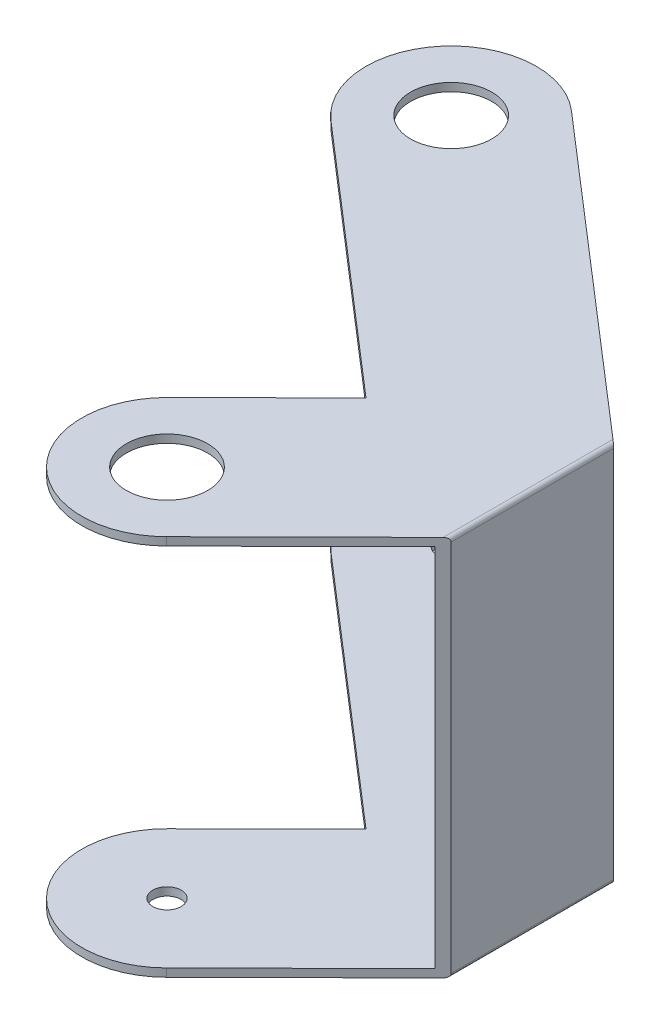
ISO-10303-21;
HEADER;
FILE_DESCRIPTION(('STEP AP214'),'2;1');
FILE_NAME('part.step','',(''),(''),'','','');
FILE_SCHEMA(('AUTOMOTIVE_DESIGN { 1 0 10303 214 1 1 1 1 }'));
ENDSEC;
DATA;
#1=APPLICATION_CONTEXT('core data for automotive mechanical design processes');
#2=APPLICATION_PROTOCOL_DEFINITION('international standard','automotive_design',2000,#1);
#3=PRODUCT_CONTEXT('',#1,'mechanical');
#4=PRODUCT('Part','Part','',(#3));
#5=PRODUCT_RELATED_PRODUCT_CATEGORY('part','',(#4));
#6=PRODUCT_DEFINITION_FORMATION('','',#4);
#7=PRODUCT_DEFINITION_CONTEXT('part definition',#1,'design');
#8=PRODUCT_DEFINITION('design','',#6,#7);
#9=PRODUCT_DEFINITION_SHAPE('','',#8);
#10=(LENGTH_UNIT() NAMED_UNIT(*) SI_UNIT(.MILLI.,.METRE.));
#11=(NAMED_UNIT(*) PLANE_ANGLE_UNIT() SI_UNIT($,.RADIAN.));
#12=(NAMED_UNIT(*) SI_UNIT($,.STERADIAN.) SOLID_ANGLE_UNIT());
#13=UNCERTAINTY_MEASURE_WITH_UNIT(LENGTH_MEASURE(1.E-05),#10,'distance_accuracy_value','');
#14=(GEOMETRIC_REPRESENTATION_CONTEXT(3) GLOBAL_UNCERTAINTY_ASSIGNED_CONTEXT((#13)) GLOBAL_UNIT_ASSIGNED_CONTEXT((#10,
#11,#12)) REPRESENTATION_CONTEXT('',''));
#15=CARTESIAN_POINT('',(0.,0.,0.));
#16=DIRECTION('',(0.,0.,1.));
#17=DIRECTION('',(1.,0.,0.));
#18=AXIS2_PLACEMENT_3D('',#15,#16,#17);
#19=CARTESIAN_POINT('',(-20.,0.,-55.));
#20=DIRECTION('',(0.,1.,0.));
#21=DIRECTION('',(0.,0.,1.));
#22=AXIS2_PLACEMENT_3D('',#19,#20,#21);
#23=PLANE('',#22);
#24=DIRECTION('',(-0.756723379962,0.,-0.65373521109));
#25=VECTOR('',#24,1.);
#26=CARTESIAN_POINT('',(25.,0.,-30.));
#27=LINE('',#26,#25);
#28=CARTESIAN_POINT('',(24.5,0.,-30.4319512442729));
#29=VERTEX_POINT('',#28);
#30=CARTESIAN_POINT('',(-13.135780283555,0.,-62.945595489601));
#31=VERTEX_POINT('',#30);
#32=EDGE_CURVE('E208',#29,#31,#27,.T.);
#33=ORIENTED_EDGE('',*,*,#32,.F.);
#34=DIRECTION('',(0.,0.,1.));
#35=VECTOR('',#34,1.);
#36=CARTESIAN_POINT('',(24.5,0.,-10.));
#37=LINE('',#36,#35);
#38=CARTESIAN_POINT('',(24.5,0.,-9.50428499112912));
#39=VERTEX_POINT('',#38);
#40=EDGE_CURVE('E257',#29,#39,#37,.T.);
#41=ORIENTED_EDGE('',*,*,#40,.T.);
#42=DIRECTION('',(-0.710143190911547,0.,0.704057276364619));
#43=VECTOR('',#42,1.);
#44=CARTESIAN_POINT('',(25.,0.,-10.));
#45=LINE('',#44,#43);
#46=CARTESIAN_POINT('',(7.3926014018285,0.,7.45650350457125));
#47=VERTEX_POINT('',#46);
#48=EDGE_CURVE('E231',#39,#47,#45,.T.);
#49=ORIENTED_EDGE('',*,*,#48,.T.);
#50=CARTESIAN_POINT('',(0.,0.,0.));
#51=DIRECTION('',(0.,1.,0.));
#52=DIRECTION('',(0.,0.,1.));
#53=AXIS2_PLACEMENT_3D('',#50,#51,#52);
#54=CIRCLE('',#53,10.5);
#55=CARTESIAN_POINT('',(-7.3926014018285,0.,-7.45650350457125));
#56=VERTEX_POINT('',#55);
#57=EDGE_CURVE('E228',#56,#47,#54,.T.);
#58=ORIENTED_EDGE('',*,*,#57,.F.);
#59=DIRECTION('',(0.710143190911547,0.,-0.704057276364619));
#60=VECTOR('',#59,1.);
#61=CARTESIAN_POINT('',(-7.3926014018285,0.,-7.45650350457125));
#62=LINE('',#61,#60);
#63=CARTESIAN_POINT('',(4.88353854108096,0.,-19.6274371459702));
#64=VERTEX_POINT('',#63);
#65=EDGE_CURVE('E225',#56,#64,#62,.T.);
#66=ORIENTED_EDGE('',*,*,#65,.T.);
#67=DIRECTION('',(0.756723379962,0.,0.65373521109));
#68=VECTOR('',#67,1.);
#69=CARTESIAN_POINT('',(-26.864219716445,0.,-47.054404510399));
#70=LINE('',#69,#68);
#71=CARTESIAN_POINT('',(-26.864219716445,0.,-47.054404510399));
#72=VERTEX_POINT('',#71);
#73=EDGE_CURVE('E222',#72,#64,#70,.T.);
#74=ORIENTED_EDGE('',*,*,#73,.F.);
#75=CARTESIAN_POINT('',(-20.,0.,-55.));
#76=DIRECTION('',(0.,1.,0.));
#77=DIRECTION('',(0.,0.,1.));
#78=AXIS2_PLACEMENT_3D('',#75,#76,#77);
#79=CIRCLE('',#78,10.5);
#80=EDGE_CURVE('E193',#31,#72,#79,.T.);
#81=ORIENTED_EDGE('',*,*,#80,.F.);
#82=EDGE_LOOP('',(#33,#41,#49,#58,#66,#74,#81));
#83=FACE_BOUND('',#82,.T.);
#84=CARTESIAN_POINT('',(-20.,0.,-55.));
#85=DIRECTION('',(0.,-1.,0.));
#86=DIRECTION('',(0.,0.,-1.));
#87=AXIS2_PLACEMENT_3D('',#84,#85,#86);
#88=CIRCLE('',#87,1.75);
#89=CARTESIAN_POINT('',(-20.,0.,-56.75));
#90=VERTEX_POINT('',#89);
#91=EDGE_CURVE('E312',#90,#90,#88,.T.);
#92=ORIENTED_EDGE('',*,*,#91,.F.);
#93=EDGE_LOOP('',(#92));
#94=FACE_BOUND('',#93,.T.);
#95=CARTESIAN_POINT('',(0.,0.,0.));
#96=DIRECTION('',(0.,-1.,0.));
#97=DIRECTION('',(0.,0.,-1.));
#98=AXIS2_PLACEMENT_3D('',#95,#96,#97);
#99=CIRCLE('',#98,1.75);
#100=CARTESIAN_POINT('',(0.,0.,-1.75));
#101=VERTEX_POINT('',#100);
#102=EDGE_CURVE('E318',#101,#101,#99,.T.);
#103=ORIENTED_EDGE('',*,*,#102,.F.);
#104=EDGE_LOOP('',(#103));
#105=FACE_BOUND('',#104,.T.);
#106=ADVANCED_FACE('F35',(#83,#94,#105),#23,.F.);
#107=CARTESIAN_POINT('',(-20.,47.,-55.));
#108=DIRECTION('',(0.,-1.,0.));
#109=DIRECTION('',(0.,0.,-1.));
#110=AXIS2_PLACEMENT_3D('',#107,#108,#109);
#111=CYLINDRICAL_SURFACE('',#110,10.5);
#112=CARTESIAN_POINT('',(-20.,1.,-55.));
#113=DIRECTION('',(0.,1.,0.));
#114=DIRECTION('',(0.,0.,1.));
#115=AXIS2_PLACEMENT_3D('',#112,#113,#114);
#116=CIRCLE('',#115,10.5);
#117=CARTESIAN_POINT('',(-13.135780283555,1.,-62.945595489601));
#118=VERTEX_POINT('',#117);
#119=CARTESIAN_POINT('',(-26.864219716445,1.,-47.054404510399));
#120=VERTEX_POINT('',#119);
#121=EDGE_CURVE('E181',#118,#120,#116,.T.);
#122=ORIENTED_EDGE('',*,*,#121,.F.);
#123=DIRECTION('',(0.,-1.,0.));
#124=VECTOR('',#123,1.);
#125=CARTESIAN_POINT('',(-13.135780283555,47.,-62.945595489601));
#126=LINE('',#125,#124);
#127=EDGE_CURVE('E173',#118,#31,#126,.T.);
#128=ORIENTED_EDGE('',*,*,#127,.T.);
#129=ORIENTED_EDGE('',*,*,#80,.T.);
#130=DIRECTION('',(0.,-1.,0.));
#131=VECTOR('',#130,1.);
#132=CARTESIAN_POINT('',(-26.864219716445,47.,-47.054404510399));
#133=LINE('',#132,#131);
#134=EDGE_CURVE('E253',#120,#72,#133,.T.);
#135=ORIENTED_EDGE('',*,*,#134,.F.);
#136=EDGE_LOOP('',(#122,#128,#129,#135));
#137=FACE_BOUND('',#136,.T.);
#138=ADVANCED_FACE('F326',(#137),#111,.T.);
#139=CARTESIAN_POINT('',(-26.864219716445,47.,-47.054404510399));
#140=DIRECTION('',(0.65373521109,0.,-0.756723379962));
#141=DIRECTION('',(-0.756723379962,0.,-0.65373521109));
#142=AXIS2_PLACEMENT_3D('',#139,#140,#141);
#143=PLANE('',#142);
#144=DIRECTION('',(0.756723379962,0.,0.65373521109));
#145=VECTOR('',#144,1.);
#146=CARTESIAN_POINT('',(-26.864219716445,1.,-47.054404510399));
#147=LINE('',#146,#145);
#148=CARTESIAN_POINT('',(4.88353854108096,1.,-19.6274371459702));
#149=VERTEX_POINT('',#148);
#150=EDGE_CURVE('E183',#120,#149,#147,.T.);
#151=ORIENTED_EDGE('',*,*,#150,.F.);
#152=ORIENTED_EDGE('',*,*,#134,.T.);
#153=ORIENTED_EDGE('',*,*,#73,.T.);
#154=DIRECTION('',(0.,-1.,0.));
#155=VECTOR('',#154,1.);
#156=CARTESIAN_POINT('',(4.88353854108096,47.,-19.6274371459702));
#157=LINE('',#156,#155);
#158=EDGE_CURVE('E249',#149,#64,#157,.T.);
#159=ORIENTED_EDGE('',*,*,#158,.F.);
#160=EDGE_LOOP('',(#151,#152,#153,#159));
#161=FACE_BOUND('',#160,.T.);
#162=ADVANCED_FACE('F331',(#161),#143,.F.);
#163=CARTESIAN_POINT('',(-7.3926014018285,47.,-7.45650350457125));
#164=DIRECTION('',(-0.704057276364619,0.,-0.710143190911547));
#165=DIRECTION('',(-0.710143190911547,0.,0.704057276364619));
#166=AXIS2_PLACEMENT_3D('',#163,#164,#165);
#167=PLANE('',#166);
#168=DIRECTION('',(0.,-1.,0.));
#169=VECTOR('',#168,1.);
#170=CARTESIAN_POINT('',(-7.3926014018285,47.,-7.45650350457125));
#171=LINE('',#170,#169);
#172=CARTESIAN_POINT('',(-7.3926014018285,1.,-7.45650350457125));
#173=VERTEX_POINT('',#172);
#174=EDGE_CURVE('E245',#173,#56,#171,.T.);
#175=ORIENTED_EDGE('',*,*,#174,.F.);
#176=DIRECTION('',(0.710143190911547,0.,-0.704057276364619));
#177=VECTOR('',#176,1.);
#178=CARTESIAN_POINT('',(-7.3926014018285,1.,-7.45650350457125));
#179=LINE('',#178,#177);
#180=EDGE_CURVE('E186',#173,#149,#179,.T.);
#181=ORIENTED_EDGE('',*,*,#180,.T.);
#182=ORIENTED_EDGE('',*,*,#158,.T.);
#183=ORIENTED_EDGE('',*,*,#65,.F.);
#184=EDGE_LOOP('',(#175,#181,#182,#183));
#185=FACE_BOUND('',#184,.T.);
#186=ADVANCED_FACE('F352',(#185),#167,.T.);
#187=CARTESIAN_POINT('',(0.,47.,0.));
#188=DIRECTION('',(0.,-1.,0.));
#189=DIRECTION('',(0.,0.,-1.));
#190=AXIS2_PLACEMENT_3D('',#187,#188,#189);
#191=CYLINDRICAL_SURFACE('',#190,10.5);
#192=CARTESIAN_POINT('',(0.,1.,0.));
#193=DIRECTION('',(0.,1.,0.));
#194=DIRECTION('',(0.,0.,1.));
#195=AXIS2_PLACEMENT_3D('',#192,#193,#194);
#196=CIRCLE('',#195,10.5);
#197=CARTESIAN_POINT('',(7.3926014018285,1.,7.45650350457125));
#198=VERTEX_POINT('',#197);
#199=EDGE_CURVE('E189',#173,#198,#196,.T.);
#200=ORIENTED_EDGE('',*,*,#199,.F.);
#201=ORIENTED_EDGE('',*,*,#174,.T.);
#202=ORIENTED_EDGE('',*,*,#57,.T.);
#203=DIRECTION('',(0.,-1.,0.));
#204=VECTOR('',#203,1.);
#205=CARTESIAN_POINT('',(7.3926014018285,47.,7.45650350457125));
#206=LINE('',#205,#204);
#207=EDGE_CURVE('E241',#198,#47,#206,.T.);
#208=ORIENTED_EDGE('',*,*,#207,.F.);
#209=EDGE_LOOP('',(#200,#201,#202,#208));
#210=FACE_BOUND('',#209,.T.);
#211=ADVANCED_FACE('F344',(#210),#191,.T.);
#212=CARTESIAN_POINT('',(25.,47.,-10.));
#213=DIRECTION('',(0.704057276364619,0.,0.710143190911547));
#214=DIRECTION('',(0.710143190911547,0.,-0.704057276364619));
#215=AXIS2_PLACEMENT_3D('',#212,#213,#214);
#216=PLANE('',#215);
#217=ORIENTED_EDGE('',*,*,#48,.F.);
#218=CARTESIAN_POINT('',(24.5,0.5,-9.50428499112913));
#219=DIRECTION('',(0.704057276364619,0.,0.710143190911547));
#220=DIRECTION('',(0.710143190911547,0.,-0.704057276364619));
#221=AXIS2_PLACEMENT_3D('',#218,#219,#220);
#222=ELLIPSE('',#221,0.704083354454465,0.5);
#223=CARTESIAN_POINT('',(25.,0.5,-10.));
#224=VERTEX_POINT('',#223);
#225=EDGE_CURVE('E262',#39,#224,#222,.T.);
#226=ORIENTED_EDGE('',*,*,#225,.T.);
#227=DIRECTION('',(0.,-1.,0.));
#228=VECTOR('',#227,1.);
#229=CARTESIAN_POINT('',(25.,47.,-10.));
#230=LINE('',#229,#228);
#231=CARTESIAN_POINT('',(25.,46.5,-10.));
#232=VERTEX_POINT('',#231);
#233=EDGE_CURVE('E239',#232,#224,#230,.T.);
#234=ORIENTED_EDGE('',*,*,#233,.F.);
#235=CARTESIAN_POINT('',(24.5,46.5,-9.50428499112913));
#236=DIRECTION('',(0.704057276364619,0.,0.710143190911547));
#237=DIRECTION('',(-0.710143190911547,0.,0.704057276364619));
#238=AXIS2_PLACEMENT_3D('',#235,#236,#237);
#239=ELLIPSE('',#238,0.704083354454465,0.5);
#240=CARTESIAN_POINT('',(24.5,47.,-9.50428499112912));
#241=VERTEX_POINT('',#240);
#242=EDGE_CURVE('E260',#232,#241,#239,.T.);
#243=ORIENTED_EDGE('',*,*,#242,.T.);
#244=DIRECTION('',(-0.710143190911547,0.,0.704057276364619));
#245=VECTOR('',#244,1.);
#246=CARTESIAN_POINT('',(25.,47.,-10.));
#247=LINE('',#246,#245);
#248=CARTESIAN_POINT('',(7.3926014018285,47.,7.45650350457125));
#249=VERTEX_POINT('',#248);
#250=EDGE_CURVE('E216',#241,#249,#247,.T.);
#251=ORIENTED_EDGE('',*,*,#250,.T.);
#252=CARTESIAN_POINT('',(7.3926014018285,46.,7.45650350457125));
#253=VERTEX_POINT('',#252);
#254=EDGE_CURVE('E242',#249,#253,#206,.T.);
#255=ORIENTED_EDGE('',*,*,#254,.T.);
#256=DIRECTION('',(-0.710143190911547,0.,0.704057276364619));
#257=VECTOR('',#256,1.);
#258=CARTESIAN_POINT('',(25.,46.,-10.));
#259=LINE('',#258,#257);
#260=CARTESIAN_POINT('',(24.,46.,-9.00856998225825));
#261=VERTEX_POINT('',#260);
#262=EDGE_CURVE('E194',#261,#253,#259,.T.);
#263=ORIENTED_EDGE('',*,*,#262,.F.);
#264=DIRECTION('',(0.,-1.,0.));
#265=VECTOR('',#264,1.);
#266=CARTESIAN_POINT('',(24.,47.,-9.00856998225825));
#267=LINE('',#266,#265);
#268=CARTESIAN_POINT('',(24.,1.,-9.00856998225825));
#269=VERTEX_POINT('',#268);
#270=EDGE_CURVE('E160',#261,#269,#267,.T.);
#271=ORIENTED_EDGE('',*,*,#270,.T.);
#272=DIRECTION('',(-0.710143190911547,0.,0.704057276364619));
#273=VECTOR('',#272,1.);
#274=CARTESIAN_POINT('',(25.,1.,-10.));
#275=LINE('',#274,#273);
#276=EDGE_CURVE('E168',#269,#198,#275,.T.);
#277=ORIENTED_EDGE('',*,*,#276,.T.);
#278=ORIENTED_EDGE('',*,*,#207,.T.);
#279=EDGE_LOOP('',(#217,#226,#234,#243,#251,#255,#263,#271,#277,#278));
#280=FACE_BOUND('',#279,.T.);
#281=ADVANCED_FACE('F281',(#280),#216,.T.);
#282=CARTESIAN_POINT('',(25.,47.,-30.));
#283=DIRECTION('',(-0.65373521109,0.,0.756723379962));
#284=DIRECTION('',(0.756723379962,0.,0.65373521109));
#285=AXIS2_PLACEMENT_3D('',#282,#283,#284);
#286=PLANE('',#285);
#287=DIRECTION('',(0.,-1.,0.));
#288=VECTOR('',#287,1.);
#289=CARTESIAN_POINT('',(25.,47.,-30.));
#290=LINE('',#289,#288);
#291=CARTESIAN_POINT('',(25.,46.5,-30.));
#292=VERTEX_POINT('',#291);
#293=CARTESIAN_POINT('',(25.,0.5,-30.));
#294=VERTEX_POINT('',#293);
#295=EDGE_CURVE('E237',#292,#294,#290,.T.);
#296=ORIENTED_EDGE('',*,*,#295,.T.);
#297=CARTESIAN_POINT('',(24.5,0.5,-30.4319512442729));
#298=DIRECTION('',(-0.65373521109,0.,0.756723379962));
#299=DIRECTION('',(-0.756723379962,0.,-0.65373521109));
#300=AXIS2_PLACEMENT_3D('',#297,#298,#299);
#301=ELLIPSE('',#300,0.660743427836349,0.5);
#302=EDGE_CURVE('E43',#294,#29,#301,.F.);
#303=ORIENTED_EDGE('',*,*,#302,.T.);
#304=ORIENTED_EDGE('',*,*,#32,.T.);
#305=ORIENTED_EDGE('',*,*,#127,.F.);
#306=DIRECTION('',(-0.756723379962,0.,-0.65373521109));
#307=VECTOR('',#306,1.);
#308=CARTESIAN_POINT('',(25.,1.,-30.));
#309=LINE('',#308,#307);
#310=CARTESIAN_POINT('',(24.,1.,-30.8639024885459));
#311=VERTEX_POINT('',#310);
#312=EDGE_CURVE('E165',#311,#118,#309,.T.);
#313=ORIENTED_EDGE('',*,*,#312,.F.);
#314=DIRECTION('',(0.,-1.,0.));
#315=VECTOR('',#314,1.);
#316=CARTESIAN_POINT('',(24.,47.,-30.8639024885459));
#317=LINE('',#316,#315);
#318=CARTESIAN_POINT('',(24.,46.,-30.8639024885459));
#319=VERTEX_POINT('',#318);
#320=EDGE_CURVE('E149',#319,#311,#317,.T.);
#321=ORIENTED_EDGE('',*,*,#320,.F.);
#322=DIRECTION('',(-0.756723379962,0.,-0.65373521109));
#323=VECTOR('',#322,1.);
#324=CARTESIAN_POINT('',(25.,46.,-30.));
#325=LINE('',#324,#323);
#326=CARTESIAN_POINT('',(-13.135780283555,46.,-62.945595489601));
#327=VERTEX_POINT('',#326);
#328=EDGE_CURVE('E161',#319,#327,#325,.T.);
#329=ORIENTED_EDGE('',*,*,#328,.T.);
#330=CARTESIAN_POINT('',(-13.135780283555,47.,-62.945595489601));
#331=VERTEX_POINT('',#330);
#332=EDGE_CURVE('E234',#331,#327,#126,.T.);
#333=ORIENTED_EDGE('',*,*,#332,.F.);
#334=DIRECTION('',(-0.756723379962,0.,-0.65373521109));
#335=VECTOR('',#334,1.);
#336=CARTESIAN_POINT('',(25.,47.,-30.));
#337=LINE('',#336,#335);
#338=CARTESIAN_POINT('',(24.5,47.,-30.4319512442729));
#339=VERTEX_POINT('',#338);
#340=EDGE_CURVE('E218',#339,#331,#337,.T.);
#341=ORIENTED_EDGE('',*,*,#340,.F.);
#342=CARTESIAN_POINT('',(24.5,46.5,-30.4319512442729));
#343=DIRECTION('',(-0.65373521109,0.,0.756723379962));
#344=DIRECTION('',(0.756723379962,0.,0.65373521109));
#345=AXIS2_PLACEMENT_3D('',#342,#343,#344);
#346=ELLIPSE('',#345,0.660743427836349,0.5);
#347=EDGE_CURVE('E268',#339,#292,#346,.F.);
#348=ORIENTED_EDGE('',*,*,#347,.T.);
#349=EDGE_LOOP('',(#296,#303,#304,#305,#313,#321,#329,#333,#341,#348));
#350=FACE_BOUND('',#349,.T.);
#351=ADVANCED_FACE('F171',(#350),#286,.F.);
#352=ORIENTED_EDGE('',*,*,#332,.T.);
#353=CARTESIAN_POINT('',(-20.,46.,-55.));
#354=DIRECTION('',(0.,1.,0.));
#355=DIRECTION('',(0.,0.,1.));
#356=AXIS2_PLACEMENT_3D('',#353,#354,#355);
#357=CIRCLE('',#356,10.5);
#358=CARTESIAN_POINT('',(-26.864219716445,46.,-47.054404510399));
#359=VERTEX_POINT('',#358);
#360=EDGE_CURVE('E174',#327,#359,#357,.T.);
#361=ORIENTED_EDGE('',*,*,#360,.T.);
#362=CARTESIAN_POINT('',(-26.864219716445,47.,-47.054404510399));
#363=VERTEX_POINT('',#362);
#364=EDGE_CURVE('E254',#363,#359,#133,.T.);
#365=ORIENTED_EDGE('',*,*,#364,.F.);
#366=CARTESIAN_POINT('',(-20.,47.,-55.));
#367=DIRECTION('',(0.,1.,0.));
#368=DIRECTION('',(0.,0.,1.));
#369=AXIS2_PLACEMENT_3D('',#366,#367,#368);
#370=CIRCLE('',#369,10.5);
#371=EDGE_CURVE('E204',#331,#363,#370,.T.);
#372=ORIENTED_EDGE('',*,*,#371,.F.);
#373=EDGE_LOOP('',(#352,#361,#365,#372));
#374=FACE_BOUND('',#373,.T.);
#375=ADVANCED_FACE('F334',(#374),#111,.T.);
#376=ORIENTED_EDGE('',*,*,#364,.T.);
#377=DIRECTION('',(0.756723379962,0.,0.65373521109));
#378=VECTOR('',#377,1.);
#379=CARTESIAN_POINT('',(-26.864219716445,46.,-47.054404510399));
#380=LINE('',#379,#378);
#381=CARTESIAN_POINT('',(4.88353854108096,46.,-19.6274371459702));
#382=VERTEX_POINT('',#381);
#383=EDGE_CURVE('E177',#359,#382,#380,.T.);
#384=ORIENTED_EDGE('',*,*,#383,.T.);
#385=CARTESIAN_POINT('',(4.88353854108096,47.,-19.6274371459702));
#386=VERTEX_POINT('',#385);
#387=EDGE_CURVE('E250',#386,#382,#157,.T.);
#388=ORIENTED_EDGE('',*,*,#387,.F.);
#389=DIRECTION('',(0.756723379962,0.,0.65373521109));
#390=VECTOR('',#389,1.);
#391=CARTESIAN_POINT('',(-26.864219716445,47.,-47.054404510399));
#392=LINE('',#391,#390);
#393=EDGE_CURVE('E207',#363,#386,#392,.T.);
#394=ORIENTED_EDGE('',*,*,#393,.F.);
#395=EDGE_LOOP('',(#376,#384,#388,#394));
#396=FACE_BOUND('',#395,.T.);
#397=ADVANCED_FACE('F350',(#396),#143,.F.);
#398=DIRECTION('',(0.710143190911547,0.,-0.704057276364619));
#399=VECTOR('',#398,1.);
#400=CARTESIAN_POINT('',(-7.3926014018285,46.,-7.45650350457125));
#401=LINE('',#400,#399);
#402=CARTESIAN_POINT('',(-7.3926014018285,46.,-7.45650350457125));
#403=VERTEX_POINT('',#402);
#404=EDGE_CURVE('E199',#403,#382,#401,.T.);
#405=ORIENTED_EDGE('',*,*,#404,.F.);
#406=CARTESIAN_POINT('',(-7.3926014018285,47.,-7.45650350457125));
#407=VERTEX_POINT('',#406);
#408=EDGE_CURVE('E246',#407,#403,#171,.T.);
#409=ORIENTED_EDGE('',*,*,#408,.F.);
#410=DIRECTION('',(0.710143190911547,0.,-0.704057276364619));
#411=VECTOR('',#410,1.);
#412=CARTESIAN_POINT('',(-7.3926014018285,47.,-7.45650350457125));
#413=LINE('',#412,#411);
#414=EDGE_CURVE('E210',#407,#386,#413,.T.);
#415=ORIENTED_EDGE('',*,*,#414,.T.);
#416=ORIENTED_EDGE('',*,*,#387,.T.);
#417=EDGE_LOOP('',(#405,#409,#415,#416));
#418=FACE_BOUND('',#417,.T.);
#419=ADVANCED_FACE('F347',(#418),#167,.T.);
#420=ORIENTED_EDGE('',*,*,#408,.T.);
#421=CARTESIAN_POINT('',(0.,46.,0.));
#422=DIRECTION('',(0.,1.,0.));
#423=DIRECTION('',(0.,0.,1.));
#424=AXIS2_PLACEMENT_3D('',#421,#422,#423);
#425=CIRCLE('',#424,10.5);
#426=EDGE_CURVE('E196',#403,#253,#425,.T.);
#427=ORIENTED_EDGE('',*,*,#426,.T.);
#428=ORIENTED_EDGE('',*,*,#254,.F.);
#429=CARTESIAN_POINT('',(0.,47.,0.));
#430=DIRECTION('',(0.,1.,0.));
#431=DIRECTION('',(0.,0.,1.));
#432=AXIS2_PLACEMENT_3D('',#429,#430,#431);
#433=CIRCLE('',#432,10.5);
#434=EDGE_CURVE('E213',#407,#249,#433,.T.);
#435=ORIENTED_EDGE('',*,*,#434,.F.);
#436=EDGE_LOOP('',(#420,#427,#428,#435));
#437=FACE_BOUND('',#436,.T.);
#438=ADVANCED_FACE('F292',(#437),#191,.T.);
#439=CARTESIAN_POINT('',(25.,47.,-30.));
#440=DIRECTION('',(1.,0.,0.));
#441=DIRECTION('',(0.,0.,-1.));
#442=AXIS2_PLACEMENT_3D('',#439,#440,#441);
#443=PLANE('',#442);
#444=ORIENTED_EDGE('',*,*,#233,.T.);
#445=DIRECTION('',(0.,0.,1.));
#446=VECTOR('',#445,1.);
#447=CARTESIAN_POINT('',(25.,0.5,-30.));
#448=LINE('',#447,#446);
#449=EDGE_CURVE('E56',#224,#294,#448,.F.);
#450=ORIENTED_EDGE('',*,*,#449,.T.);
#451=ORIENTED_EDGE('',*,*,#295,.F.);
#452=DIRECTION('',(0.,0.,1.));
#453=VECTOR('',#452,1.);
#454=CARTESIAN_POINT('',(25.,46.5,-30.));
#455=LINE('',#454,#453);
#456=EDGE_CURVE('E264',#292,#232,#455,.T.);
#457=ORIENTED_EDGE('',*,*,#456,.T.);
#458=EDGE_LOOP('',(#444,#450,#451,#457));
#459=FACE_BOUND('',#458,.T.);
#460=ADVANCED_FACE('F283',(#459),#443,.T.);
#461=CARTESIAN_POINT('',(-20.,47.,-55.));
#462=DIRECTION('',(0.,1.,0.));
#463=DIRECTION('',(0.,0.,1.));
#464=AXIS2_PLACEMENT_3D('',#461,#462,#463);
#465=PLANE('',#464);
#466=CARTESIAN_POINT('',(0.,47.,0.));
#467=DIRECTION('',(0.,1.,0.));
#468=DIRECTION('',(0.,0.,1.));
#469=AXIS2_PLACEMENT_3D('',#466,#467,#468);
#470=CIRCLE('',#469,5.);
#471=CARTESIAN_POINT('',(0.,47.,5.));
#472=VERTEX_POINT('',#471);
#473=EDGE_CURVE('E306',#472,#472,#470,.T.);
#474=ORIENTED_EDGE('',*,*,#473,.F.);
#475=EDGE_LOOP('',(#474));
#476=FACE_BOUND('',#475,.T.);
#477=CARTESIAN_POINT('',(-20.,47.,-55.));
#478=DIRECTION('',(0.,1.,0.));
#479=DIRECTION('',(0.,0.,1.));
#480=AXIS2_PLACEMENT_3D('',#477,#478,#479);
#481=CIRCLE('',#480,5.);
#482=CARTESIAN_POINT('',(-20.,47.,-50.));
#483=VERTEX_POINT('',#482);
#484=EDGE_CURVE('E300',#483,#483,#481,.T.);
#485=ORIENTED_EDGE('',*,*,#484,.F.);
#486=EDGE_LOOP('',(#485));
#487=FACE_BOUND('',#486,.T.);
#488=ORIENTED_EDGE('',*,*,#250,.F.);
#489=DIRECTION('',(0.,0.,1.));
#490=VECTOR('',#489,1.);
#491=CARTESIAN_POINT('',(24.5,47.,-55.));
#492=LINE('',#491,#490);
#493=EDGE_CURVE('E11',#241,#339,#492,.F.);
#494=ORIENTED_EDGE('',*,*,#493,.T.);
#495=ORIENTED_EDGE('',*,*,#340,.T.);
#496=ORIENTED_EDGE('',*,*,#371,.T.);
#497=ORIENTED_EDGE('',*,*,#393,.T.);
#498=ORIENTED_EDGE('',*,*,#414,.F.);
#499=ORIENTED_EDGE('',*,*,#434,.T.);
#500=EDGE_LOOP('',(#488,#494,#495,#496,#497,#498,#499));
#501=FACE_BOUND('',#500,.T.);
#502=ADVANCED_FACE('F287',(#476,#487,#501),#465,.T.);
#503=CARTESIAN_POINT('',(24.,47.,-30.));
#504=DIRECTION('',(1.,0.,0.));
#505=DIRECTION('',(0.,0.,-1.));
#506=AXIS2_PLACEMENT_3D('',#503,#504,#505);
#507=PLANE('',#506);
#508=DIRECTION('',(0.,0.,1.));
#509=VECTOR('',#508,1.);
#510=CARTESIAN_POINT('',(24.,1.,-30.));
#511=LINE('',#510,#509);
#512=EDGE_CURVE('E152',#311,#269,#511,.T.);
#513=ORIENTED_EDGE('',*,*,#512,.T.);
#514=ORIENTED_EDGE('',*,*,#270,.F.);
#515=DIRECTION('',(0.,0.,1.));
#516=VECTOR('',#515,1.);
#517=CARTESIAN_POINT('',(24.,46.,-30.));
#518=LINE('',#517,#516);
#519=EDGE_CURVE('E155',#319,#261,#518,.T.);
#520=ORIENTED_EDGE('',*,*,#519,.F.);
#521=ORIENTED_EDGE('',*,*,#320,.T.);
#522=EDGE_LOOP('',(#513,#514,#520,#521));
#523=FACE_BOUND('',#522,.T.);
#524=ADVANCED_FACE('F151',(#523),#507,.F.);
#525=CARTESIAN_POINT('',(-20.,46.,-55.));
#526=DIRECTION('',(0.,1.,0.));
#527=DIRECTION('',(0.,0.,1.));
#528=AXIS2_PLACEMENT_3D('',#525,#526,#527);
#529=PLANE('',#528);
#530=CARTESIAN_POINT('',(0.,46.,0.));
#531=DIRECTION('',(0.,1.,0.));
#532=DIRECTION('',(0.,0.,1.));
#533=AXIS2_PLACEMENT_3D('',#530,#531,#532);
#534=CIRCLE('',#533,5.);
#535=CARTESIAN_POINT('',(0.,46.,5.));
#536=VERTEX_POINT('',#535);
#537=EDGE_CURVE('E303',#536,#536,#534,.T.);
#538=ORIENTED_EDGE('',*,*,#537,.T.);
#539=EDGE_LOOP('',(#538));
#540=FACE_BOUND('',#539,.T.);
#541=CARTESIAN_POINT('',(-20.,46.,-55.));
#542=DIRECTION('',(0.,1.,0.));
#543=DIRECTION('',(0.,0.,1.));
#544=AXIS2_PLACEMENT_3D('',#541,#542,#543);
#545=CIRCLE('',#544,5.);
#546=CARTESIAN_POINT('',(-20.,46.,-50.));
#547=VERTEX_POINT('',#546);
#548=EDGE_CURVE('E184',#547,#547,#545,.T.);
#549=ORIENTED_EDGE('',*,*,#548,.T.);
#550=EDGE_LOOP('',(#549));
#551=FACE_BOUND('',#550,.T.);
#552=ORIENTED_EDGE('',*,*,#360,.F.);
#553=ORIENTED_EDGE('',*,*,#328,.F.);
#554=ORIENTED_EDGE('',*,*,#519,.T.);
#555=ORIENTED_EDGE('',*,*,#262,.T.);
#556=ORIENTED_EDGE('',*,*,#426,.F.);
#557=ORIENTED_EDGE('',*,*,#404,.T.);
#558=ORIENTED_EDGE('',*,*,#383,.F.);
#559=EDGE_LOOP('',(#552,#553,#554,#555,#556,#557,#558));
#560=FACE_BOUND('',#559,.T.);
#561=ADVANCED_FACE('F295',(#540,#551,#560),#529,.F.);
#562=CARTESIAN_POINT('',(-20.,1.,-55.));
#563=DIRECTION('',(0.,1.,0.));
#564=DIRECTION('',(0.,0.,1.));
#565=AXIS2_PLACEMENT_3D('',#562,#563,#564);
#566=PLANE('',#565);
#567=CARTESIAN_POINT('',(0.,1.,0.));
#568=DIRECTION('',(0.,1.,0.));
#569=DIRECTION('',(0.,0.,1.));
#570=AXIS2_PLACEMENT_3D('',#567,#568,#569);
#571=CIRCLE('',#570,1.75);
#572=CARTESIAN_POINT('',(0.,1.,1.75));
#573=VERTEX_POINT('',#572);
#574=EDGE_CURVE('E315',#573,#573,#571,.T.);
#575=ORIENTED_EDGE('',*,*,#574,.F.);
#576=EDGE_LOOP('',(#575));
#577=FACE_BOUND('',#576,.T.);
#578=CARTESIAN_POINT('',(-20.,1.,-55.));
#579=DIRECTION('',(0.,1.,0.));
#580=DIRECTION('',(0.,0.,1.));
#581=AXIS2_PLACEMENT_3D('',#578,#579,#580);
#582=CIRCLE('',#581,1.75);
#583=CARTESIAN_POINT('',(-20.,1.,-53.25));
#584=VERTEX_POINT('',#583);
#585=EDGE_CURVE('E309',#584,#584,#582,.T.);
#586=ORIENTED_EDGE('',*,*,#585,.F.);
#587=EDGE_LOOP('',(#586));
#588=FACE_BOUND('',#587,.T.);
#589=ORIENTED_EDGE('',*,*,#121,.T.);
#590=ORIENTED_EDGE('',*,*,#150,.T.);
#591=ORIENTED_EDGE('',*,*,#180,.F.);
#592=ORIENTED_EDGE('',*,*,#199,.T.);
#593=ORIENTED_EDGE('',*,*,#276,.F.);
#594=ORIENTED_EDGE('',*,*,#512,.F.);
#595=ORIENTED_EDGE('',*,*,#312,.T.);
#596=EDGE_LOOP('',(#589,#590,#591,#592,#593,#594,#595));
#597=FACE_BOUND('',#596,.T.);
#598=ADVANCED_FACE('F164',(#577,#588,#597),#566,.T.);
#599=CARTESIAN_POINT('',(24.5,0.5,-55.));
#600=DIRECTION('',(0.,0.,-1.));
#601=DIRECTION('',(-1.,0.,0.));
#602=AXIS2_PLACEMENT_3D('',#599,#600,#601);
#603=CYLINDRICAL_SURFACE('',#602,0.5);
#604=ORIENTED_EDGE('',*,*,#302,.F.);
#605=ORIENTED_EDGE('',*,*,#449,.F.);
#606=ORIENTED_EDGE('',*,*,#225,.F.);
#607=ORIENTED_EDGE('',*,*,#40,.F.);
#608=EDGE_LOOP('',(#604,#605,#606,#607));
#609=FACE_BOUND('',#608,.T.);
#610=ADVANCED_FACE('F278',(#609),#603,.T.);
#611=CARTESIAN_POINT('',(24.5,46.5,-30.));
#612=DIRECTION('',(0.,0.,1.));
#613=DIRECTION('',(1.,0.,0.));
#614=AXIS2_PLACEMENT_3D('',#611,#612,#613);
#615=CYLINDRICAL_SURFACE('',#614,0.5);
#616=ORIENTED_EDGE('',*,*,#347,.F.);
#617=ORIENTED_EDGE('',*,*,#493,.F.);
#618=ORIENTED_EDGE('',*,*,#242,.F.);
#619=ORIENTED_EDGE('',*,*,#456,.F.);
#620=EDGE_LOOP('',(#616,#617,#618,#619));
#621=FACE_BOUND('',#620,.T.);
#622=ADVANCED_FACE('F37',(#621),#615,.T.);
#623=CARTESIAN_POINT('',(-20.,47.,-55.));
#624=DIRECTION('',(0.,1.,0.));
#625=DIRECTION('',(0.,0.,1.));
#626=AXIS2_PLACEMENT_3D('',#623,#624,#625);
#627=CYLINDRICAL_SURFACE('',#626,5.);
#628=ORIENTED_EDGE('',*,*,#548,.F.);
#629=EDGE_LOOP('',(#628));
#630=FACE_BOUND('',#629,.T.);
#631=ORIENTED_EDGE('',*,*,#484,.T.);
#632=EDGE_LOOP('',(#631));
#633=FACE_BOUND('',#632,.T.);
#634=ADVANCED_FACE('F362',(#630,#633),#627,.F.);
#635=CARTESIAN_POINT('',(0.,47.,0.));
#636=DIRECTION('',(0.,1.,0.));
#637=DIRECTION('',(0.,0.,1.));
#638=AXIS2_PLACEMENT_3D('',#635,#636,#637);
#639=CYLINDRICAL_SURFACE('',#638,5.);
#640=ORIENTED_EDGE('',*,*,#537,.F.);
#641=EDGE_LOOP('',(#640));
#642=FACE_BOUND('',#641,.T.);
#643=ORIENTED_EDGE('',*,*,#473,.T.);
#644=EDGE_LOOP('',(#643));
#645=FACE_BOUND('',#644,.T.);
#646=ADVANCED_FACE('F376',(#642,#645),#639,.F.);
#647=CARTESIAN_POINT('',(-20.,0.,-55.));
#648=DIRECTION('',(0.,-1.,0.));
#649=DIRECTION('',(0.,0.,-1.));
#650=AXIS2_PLACEMENT_3D('',#647,#648,#649);
#651=CYLINDRICAL_SURFACE('',#650,1.75);
#652=ORIENTED_EDGE('',*,*,#91,.T.);
#653=EDGE_LOOP('',(#652));
#654=FACE_BOUND('',#653,.T.);
#655=ORIENTED_EDGE('',*,*,#585,.T.);
#656=EDGE_LOOP('',(#655));
#657=FACE_BOUND('',#656,.T.);
#658=ADVANCED_FACE('F380',(#654,#657),#651,.F.);
#659=CARTESIAN_POINT('',(0.,0.,0.));
#660=DIRECTION('',(0.,-1.,0.));
#661=DIRECTION('',(0.,0.,-1.));
#662=AXIS2_PLACEMENT_3D('',#659,#660,#661);
#663=CYLINDRICAL_SURFACE('',#662,1.75);
#664=ORIENTED_EDGE('',*,*,#102,.T.);
#665=EDGE_LOOP('',(#664));
#666=FACE_BOUND('',#665,.T.);
#667=ORIENTED_EDGE('',*,*,#574,.T.);
#668=EDGE_LOOP('',(#667));
#669=FACE_BOUND('',#668,.T.);
#670=ADVANCED_FACE('F322',(#666,#669),#663,.F.);
#671=CLOSED_SHELL('',(#106,#138,#162,#186,#211,#281,#351,#375,#397,#419,#438,#460,#502,#524,
#561,#598,#610,#622,#634,#646,#658,#670));
#672=MANIFOLD_SOLID_BREP('B2',#671);
#673=ADVANCED_BREP_SHAPE_REPRESENTATION('',(#18,#672),#14);
#674=SHAPE_DEFINITION_REPRESENTATION(#9,#673);
ENDSEC;
END-ISO-10303-21;
